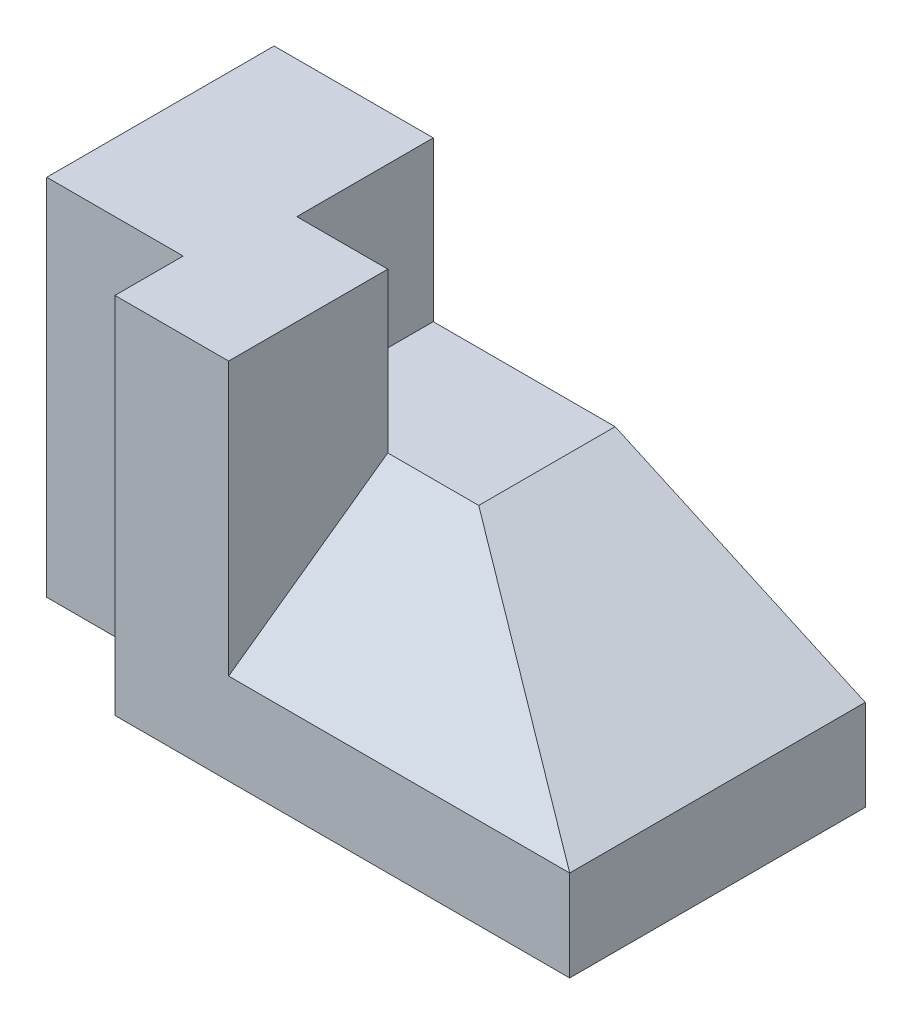
ISO-10303-21;
HEADER;
FILE_DESCRIPTION(('STEP AP214'),'2;1');
FILE_NAME('part.step','',(''),(''),'','','');
FILE_SCHEMA(('AUTOMOTIVE_DESIGN { 1 0 10303 214 1 1 1 1 }'));
ENDSEC;
DATA;
#1=APPLICATION_CONTEXT('core data for automotive mechanical design processes');
#2=APPLICATION_PROTOCOL_DEFINITION('international standard','automotive_design',2000,#1);
#3=PRODUCT_CONTEXT('',#1,'mechanical');
#4=PRODUCT('Part','Part','',(#3));
#5=PRODUCT_RELATED_PRODUCT_CATEGORY('part','',(#4));
#6=PRODUCT_DEFINITION_FORMATION('','',#4);
#7=PRODUCT_DEFINITION_CONTEXT('part definition',#1,'design');
#8=PRODUCT_DEFINITION('design','',#6,#7);
#9=PRODUCT_DEFINITION_SHAPE('','',#8);
#10=(LENGTH_UNIT() NAMED_UNIT(*) SI_UNIT(.MILLI.,.METRE.));
#11=(NAMED_UNIT(*) PLANE_ANGLE_UNIT() SI_UNIT($,.RADIAN.));
#12=(NAMED_UNIT(*) SI_UNIT($,.STERADIAN.) SOLID_ANGLE_UNIT());
#13=UNCERTAINTY_MEASURE_WITH_UNIT(LENGTH_MEASURE(1.E-05),#10,'distance_accuracy_value','');
#14=(GEOMETRIC_REPRESENTATION_CONTEXT(3) GLOBAL_UNCERTAINTY_ASSIGNED_CONTEXT((#13)) GLOBAL_UNIT_ASSIGNED_CONTEXT((#10,
#11,#12)) REPRESENTATION_CONTEXT('',''));
#15=CARTESIAN_POINT('',(0.,0.,0.));
#16=DIRECTION('',(0.,0.,1.));
#17=DIRECTION('',(1.,0.,0.));
#18=AXIS2_PLACEMENT_3D('',#15,#16,#17);
#19=CARTESIAN_POINT('',(0.,0.,-20.));
#20=DIRECTION('',(0.,0.,1.));
#21=DIRECTION('',(1.,0.,0.));
#22=AXIS2_PLACEMENT_3D('',#19,#20,#21);
#23=PLANE('',#22);
#24=DIRECTION('',(0.,-1.,0.));
#25=VECTOR('',#24,1.);
#26=CARTESIAN_POINT('',(5.,45.,-20.));
#27=LINE('',#26,#25);
#28=CARTESIAN_POINT('',(5.,80.,-20.));
#29=VERTEX_POINT('',#28);
#30=CARTESIAN_POINT('',(5.,45.,-20.));
#31=VERTEX_POINT('',#30);
#32=EDGE_CURVE('E142',#29,#31,#27,.T.);
#33=ORIENTED_EDGE('',*,*,#32,.F.);
#34=DIRECTION('',(1.,0.,0.));
#35=VECTOR('',#34,1.);
#36=CARTESIAN_POINT('',(0.,80.,-20.));
#37=LINE('',#36,#35);
#38=CARTESIAN_POINT('',(25.,80.,-20.));
#39=VERTEX_POINT('',#38);
#40=EDGE_CURVE('E147',#29,#39,#37,.T.);
#41=ORIENTED_EDGE('',*,*,#40,.T.);
#42=DIRECTION('',(0.,-1.,0.));
#43=VECTOR('',#42,1.);
#44=CARTESIAN_POINT('',(25.,0.,-20.));
#45=LINE('',#44,#43);
#46=CARTESIAN_POINT('',(25.,45.,-20.));
#47=VERTEX_POINT('',#46);
#48=EDGE_CURVE('E214',#39,#47,#45,.T.);
#49=ORIENTED_EDGE('',*,*,#48,.T.);
#50=DIRECTION('',(1.,0.,0.));
#51=VECTOR('',#50,1.);
#52=CARTESIAN_POINT('',(0.,45.,-20.));
#53=LINE('',#52,#51);
#54=EDGE_CURVE('E180',#31,#47,#53,.T.);
#55=ORIENTED_EDGE('',*,*,#54,.F.);
#56=EDGE_LOOP('',(#33,#41,#49,#55));
#57=FACE_BOUND('',#56,.T.);
#58=ADVANCED_FACE('F42',(#57),#23,.F.);
#59=CARTESIAN_POINT('',(0.,45.,-50.));
#60=DIRECTION('',(0.,-1.,0.));
#61=DIRECTION('',(0.,0.,-1.));
#62=AXIS2_PLACEMENT_3D('',#59,#60,#61);
#63=PLANE('',#62);
#64=DIRECTION('',(0.,0.,1.));
#65=VECTOR('',#64,1.);
#66=CARTESIAN_POINT('',(5.,45.,-50.));
#67=LINE('',#66,#65);
#68=CARTESIAN_POINT('',(4.99999999999999,45.,-50.));
#69=VERTEX_POINT('',#68);
#70=EDGE_CURVE('E58',#69,#31,#67,.T.);
#71=ORIENTED_EDGE('',*,*,#70,.T.);
#72=ORIENTED_EDGE('',*,*,#54,.T.);
#73=DIRECTION('',(1.,0.,0.));
#74=VECTOR('',#73,1.);
#75=CARTESIAN_POINT('',(25.,45.,-20.));
#76=LINE('',#75,#74);
#77=CARTESIAN_POINT('',(45.,45.,-20.));
#78=VERTEX_POINT('',#77);
#79=EDGE_CURVE('E159',#47,#78,#76,.T.);
#80=ORIENTED_EDGE('',*,*,#79,.T.);
#81=DIRECTION('',(0.,0.,1.));
#82=VECTOR('',#81,1.);
#83=CARTESIAN_POINT('',(45.,45.,-50.));
#84=LINE('',#83,#82);
#85=CARTESIAN_POINT('',(45.,45.,-50.));
#86=VERTEX_POINT('',#85);
#87=EDGE_CURVE('E168',#86,#78,#84,.T.);
#88=ORIENTED_EDGE('',*,*,#87,.F.);
#89=DIRECTION('',(1.,0.,0.));
#90=VECTOR('',#89,1.);
#91=CARTESIAN_POINT('',(0.,45.,-50.));
#92=LINE('',#91,#90);
#93=EDGE_CURVE('E65',#69,#86,#92,.T.);
#94=ORIENTED_EDGE('',*,*,#93,.F.);
#95=EDGE_LOOP('',(#71,#72,#80,#88,#94));
#96=FACE_BOUND('',#95,.T.);
#97=ADVANCED_FACE('F269',(#96),#63,.F.);
#98=CARTESIAN_POINT('',(0.,0.,-50.));
#99=DIRECTION('',(0.,1.,0.));
#100=DIRECTION('',(-1.,0.,0.));
#101=AXIS2_PLACEMENT_3D('',#98,#99,#100);
#102=PLANE('',#101);
#103=DIRECTION('',(0.,0.,1.));
#104=VECTOR('',#103,1.);
#105=CARTESIAN_POINT('',(100.,0.,-20.));
#106=LINE('',#105,#104);
#107=CARTESIAN_POINT('',(100.,0.,-50.));
#108=VERTEX_POINT('',#107);
#109=CARTESIAN_POINT('',(100.,0.,15.));
#110=VERTEX_POINT('',#109);
#111=EDGE_CURVE('E220',#108,#110,#106,.T.);
#112=ORIENTED_EDGE('',*,*,#111,.T.);
#113=DIRECTION('',(-1.,0.,0.));
#114=VECTOR('',#113,1.);
#115=CARTESIAN_POINT('',(0.,0.,15.));
#116=LINE('',#115,#114);
#117=CARTESIAN_POINT('',(0.,0.,15.));
#118=VERTEX_POINT('',#117);
#119=EDGE_CURVE('E186',#110,#118,#116,.T.);
#120=ORIENTED_EDGE('',*,*,#119,.T.);
#121=DIRECTION('',(0.,0.,-1.));
#122=VECTOR('',#121,1.);
#123=CARTESIAN_POINT('',(0.,0.,15.));
#124=LINE('',#123,#122);
#125=CARTESIAN_POINT('',(0.,0.,0.));
#126=VERTEX_POINT('',#125);
#127=EDGE_CURVE('E203',#118,#126,#124,.T.);
#128=ORIENTED_EDGE('',*,*,#127,.T.);
#129=DIRECTION('',(-1.,0.,0.));
#130=VECTOR('',#129,1.);
#131=CARTESIAN_POINT('',(0.,0.,0.));
#132=LINE('',#131,#130);
#133=CARTESIAN_POINT('',(-30.,0.,0.));
#134=VERTEX_POINT('',#133);
#135=EDGE_CURVE('E136',#126,#134,#132,.T.);
#136=ORIENTED_EDGE('',*,*,#135,.T.);
#137=DIRECTION('',(0.,0.,1.));
#138=VECTOR('',#137,1.);
#139=CARTESIAN_POINT('',(-30.,0.,-50.));
#140=LINE('',#139,#138);
#141=CARTESIAN_POINT('',(-30.,0.,-50.));
#142=VERTEX_POINT('',#141);
#143=EDGE_CURVE('E51',#142,#134,#140,.T.);
#144=ORIENTED_EDGE('',*,*,#143,.F.);
#145=DIRECTION('',(-1.,0.,0.));
#146=VECTOR('',#145,1.);
#147=CARTESIAN_POINT('',(0.,0.,-50.));
#148=LINE('',#147,#146);
#149=EDGE_CURVE('E230',#108,#142,#148,.T.);
#150=ORIENTED_EDGE('',*,*,#149,.F.);
#151=EDGE_LOOP('',(#112,#120,#128,#136,#144,#150));
#152=FACE_BOUND('',#151,.T.);
#153=ADVANCED_FACE('F278',(#152),#102,.F.);
#154=CARTESIAN_POINT('',(-30.,0.,-50.));
#155=DIRECTION('',(1.,0.,0.));
#156=DIRECTION('',(0.,0.,-1.));
#157=AXIS2_PLACEMENT_3D('',#154,#155,#156);
#158=PLANE('',#157);
#159=DIRECTION('',(0.,1.,0.));
#160=VECTOR('',#159,1.);
#161=CARTESIAN_POINT('',(-30.,0.,0.));
#162=LINE('',#161,#160);
#163=CARTESIAN_POINT('',(-30.,80.,0.));
#164=VERTEX_POINT('',#163);
#165=EDGE_CURVE('E236',#134,#164,#162,.T.);
#166=ORIENTED_EDGE('',*,*,#165,.T.);
#167=DIRECTION('',(0.,0.,1.));
#168=VECTOR('',#167,1.);
#169=CARTESIAN_POINT('',(-30.,80.,-50.));
#170=LINE('',#169,#168);
#171=CARTESIAN_POINT('',(-30.,80.,-50.));
#172=VERTEX_POINT('',#171);
#173=EDGE_CURVE('E233',#172,#164,#170,.T.);
#174=ORIENTED_EDGE('',*,*,#173,.F.);
#175=DIRECTION('',(0.,1.,0.));
#176=VECTOR('',#175,1.);
#177=CARTESIAN_POINT('',(-30.,0.,-50.));
#178=LINE('',#177,#176);
#179=EDGE_CURVE('E130',#142,#172,#178,.T.);
#180=ORIENTED_EDGE('',*,*,#179,.F.);
#181=ORIENTED_EDGE('',*,*,#143,.T.);
#182=EDGE_LOOP('',(#166,#174,#180,#181));
#183=FACE_BOUND('',#182,.T.);
#184=ADVANCED_FACE('F280',(#183),#158,.F.);
#185=CARTESIAN_POINT('',(0.,80.,-50.));
#186=DIRECTION('',(0.,-1.,0.));
#187=DIRECTION('',(0.,0.,-1.));
#188=AXIS2_PLACEMENT_3D('',#185,#186,#187);
#189=PLANE('',#188);
#190=DIRECTION('',(1.,0.,0.));
#191=VECTOR('',#190,1.);
#192=CARTESIAN_POINT('',(0.,80.,0.));
#193=LINE('',#192,#191);
#194=CARTESIAN_POINT('',(0.,80.,0.));
#195=VERTEX_POINT('',#194);
#196=EDGE_CURVE('E224',#164,#195,#193,.T.);
#197=ORIENTED_EDGE('',*,*,#196,.T.);
#198=DIRECTION('',(0.,0.,-1.));
#199=VECTOR('',#198,1.);
#200=CARTESIAN_POINT('',(0.,80.,15.));
#201=LINE('',#200,#199);
#202=CARTESIAN_POINT('',(0.,80.,15.));
#203=VERTEX_POINT('',#202);
#204=EDGE_CURVE('E210',#203,#195,#201,.T.);
#205=ORIENTED_EDGE('',*,*,#204,.F.);
#206=DIRECTION('',(1.,0.,0.));
#207=VECTOR('',#206,1.);
#208=CARTESIAN_POINT('',(0.,80.,15.));
#209=LINE('',#208,#207);
#210=CARTESIAN_POINT('',(25.,80.,15.));
#211=VERTEX_POINT('',#210);
#212=EDGE_CURVE('E196',#203,#211,#209,.T.);
#213=ORIENTED_EDGE('',*,*,#212,.T.);
#214=DIRECTION('',(0.,0.,1.));
#215=VECTOR('',#214,1.);
#216=CARTESIAN_POINT('',(25.,80.,-20.));
#217=LINE('',#216,#215);
#218=EDGE_CURVE('E221',#39,#211,#217,.T.);
#219=ORIENTED_EDGE('',*,*,#218,.F.);
#220=ORIENTED_EDGE('',*,*,#40,.F.);
#221=DIRECTION('',(0.,0.,1.));
#222=VECTOR('',#221,1.);
#223=CARTESIAN_POINT('',(5.,80.,-50.));
#224=LINE('',#223,#222);
#225=CARTESIAN_POINT('',(5.,80.,-50.));
#226=VERTEX_POINT('',#225);
#227=EDGE_CURVE('E139',#226,#29,#224,.T.);
#228=ORIENTED_EDGE('',*,*,#227,.F.);
#229=DIRECTION('',(1.,0.,0.));
#230=VECTOR('',#229,1.);
#231=CARTESIAN_POINT('',(0.,80.,-50.));
#232=LINE('',#231,#230);
#233=EDGE_CURVE('E126',#172,#226,#232,.T.);
#234=ORIENTED_EDGE('',*,*,#233,.F.);
#235=ORIENTED_EDGE('',*,*,#173,.T.);
#236=EDGE_LOOP('',(#197,#205,#213,#219,#220,#228,#234,#235));
#237=FACE_BOUND('',#236,.T.);
#238=ADVANCED_FACE('F44',(#237),#189,.F.);
#239=CARTESIAN_POINT('',(0.,0.,-50.));
#240=DIRECTION('',(0.,0.,1.));
#241=DIRECTION('',(1.,0.,0.));
#242=AXIS2_PLACEMENT_3D('',#239,#240,#241);
#243=PLANE('',#242);
#244=ORIENTED_EDGE('',*,*,#233,.T.);
#245=DIRECTION('',(0.,-1.,0.));
#246=VECTOR('',#245,1.);
#247=CARTESIAN_POINT('',(5.,45.,-50.));
#248=LINE('',#247,#246);
#249=EDGE_CURVE('E128',#226,#69,#248,.T.);
#250=ORIENTED_EDGE('',*,*,#249,.T.);
#251=ORIENTED_EDGE('',*,*,#93,.T.);
#252=DIRECTION('',(0.910366477462605,-0.413802944301184,0.));
#253=VECTOR('',#252,1.);
#254=CARTESIAN_POINT('',(100.,20.,-50.));
#255=LINE('',#254,#253);
#256=CARTESIAN_POINT('',(100.,20.,-50.));
#257=VERTEX_POINT('',#256);
#258=EDGE_CURVE('E163',#86,#257,#255,.T.);
#259=ORIENTED_EDGE('',*,*,#258,.T.);
#260=DIRECTION('',(0.,1.,0.));
#261=VECTOR('',#260,1.);
#262=CARTESIAN_POINT('',(100.,20.,-50.));
#263=LINE('',#262,#261);
#264=EDGE_CURVE('E173',#108,#257,#263,.T.);
#265=ORIENTED_EDGE('',*,*,#264,.F.);
#266=ORIENTED_EDGE('',*,*,#149,.T.);
#267=ORIENTED_EDGE('',*,*,#179,.T.);
#268=EDGE_LOOP('',(#244,#250,#251,#259,#265,#266,#267));
#269=FACE_BOUND('',#268,.T.);
#270=ADVANCED_FACE('F127',(#269),#243,.F.);
#271=CARTESIAN_POINT('',(0.,0.,0.));
#272=DIRECTION('',(0.,0.,1.));
#273=DIRECTION('',(1.,0.,0.));
#274=AXIS2_PLACEMENT_3D('',#271,#272,#273);
#275=PLANE('',#274);
#276=DIRECTION('',(0.,-1.,0.));
#277=VECTOR('',#276,1.);
#278=CARTESIAN_POINT('',(0.,0.,0.));
#279=LINE('',#278,#277);
#280=EDGE_CURVE('E183',#195,#126,#279,.T.);
#281=ORIENTED_EDGE('',*,*,#280,.F.);
#282=ORIENTED_EDGE('',*,*,#196,.F.);
#283=ORIENTED_EDGE('',*,*,#165,.F.);
#284=ORIENTED_EDGE('',*,*,#135,.F.);
#285=EDGE_LOOP('',(#281,#282,#283,#284));
#286=FACE_BOUND('',#285,.T.);
#287=ADVANCED_FACE('F248',(#286),#275,.T.);
#288=CARTESIAN_POINT('',(25.,0.,-20.));
#289=DIRECTION('',(-1.,0.,0.));
#290=DIRECTION('',(0.,-1.,0.));
#291=AXIS2_PLACEMENT_3D('',#288,#289,#290);
#292=PLANE('',#291);
#293=DIRECTION('',(0.,-1.,0.));
#294=VECTOR('',#293,1.);
#295=CARTESIAN_POINT('',(25.,0.,15.));
#296=LINE('',#295,#294);
#297=CARTESIAN_POINT('',(25.,20.,15.));
#298=VERTEX_POINT('',#297);
#299=EDGE_CURVE('E193',#211,#298,#296,.T.);
#300=ORIENTED_EDGE('',*,*,#299,.T.);
#301=DIRECTION('',(0.,0.581238193719096,-0.813733471206735));
#302=VECTOR('',#301,1.);
#303=CARTESIAN_POINT('',(25.,45.,-20.));
#304=LINE('',#303,#302);
#305=EDGE_CURVE('E149',#298,#47,#304,.T.);
#306=ORIENTED_EDGE('',*,*,#305,.T.);
#307=ORIENTED_EDGE('',*,*,#48,.F.);
#308=ORIENTED_EDGE('',*,*,#218,.T.);
#309=EDGE_LOOP('',(#300,#306,#307,#308));
#310=FACE_BOUND('',#309,.T.);
#311=ADVANCED_FACE('F263',(#310),#292,.F.);
#312=CARTESIAN_POINT('',(100.,0.,-20.));
#313=DIRECTION('',(-1.,0.,0.));
#314=DIRECTION('',(0.,0.,1.));
#315=AXIS2_PLACEMENT_3D('',#312,#313,#314);
#316=PLANE('',#315);
#317=ORIENTED_EDGE('',*,*,#264,.T.);
#318=DIRECTION('',(0.,0.,1.));
#319=VECTOR('',#318,1.);
#320=CARTESIAN_POINT('',(100.,20.,-50.));
#321=LINE('',#320,#319);
#322=CARTESIAN_POINT('',(100.,20.,15.));
#323=VERTEX_POINT('',#322);
#324=EDGE_CURVE('E169',#257,#323,#321,.T.);
#325=ORIENTED_EDGE('',*,*,#324,.T.);
#326=DIRECTION('',(0.,-1.,0.));
#327=VECTOR('',#326,1.);
#328=CARTESIAN_POINT('',(100.,0.,15.));
#329=LINE('',#328,#327);
#330=EDGE_CURVE('E190',#323,#110,#329,.T.);
#331=ORIENTED_EDGE('',*,*,#330,.T.);
#332=ORIENTED_EDGE('',*,*,#111,.F.);
#333=EDGE_LOOP('',(#317,#325,#331,#332));
#334=FACE_BOUND('',#333,.T.);
#335=ADVANCED_FACE('F276',(#334),#316,.F.);
#336=CARTESIAN_POINT('',(0.,0.,15.));
#337=DIRECTION('',(1.,0.,0.));
#338=DIRECTION('',(0.,1.,0.));
#339=AXIS2_PLACEMENT_3D('',#336,#337,#338);
#340=PLANE('',#339);
#341=ORIENTED_EDGE('',*,*,#280,.T.);
#342=ORIENTED_EDGE('',*,*,#127,.F.);
#343=DIRECTION('',(0.,-1.,0.));
#344=VECTOR('',#343,1.);
#345=CARTESIAN_POINT('',(0.,0.,15.));
#346=LINE('',#345,#344);
#347=EDGE_CURVE('E200',#203,#118,#346,.T.);
#348=ORIENTED_EDGE('',*,*,#347,.F.);
#349=ORIENTED_EDGE('',*,*,#204,.T.);
#350=EDGE_LOOP('',(#341,#342,#348,#349));
#351=FACE_BOUND('',#350,.T.);
#352=ADVANCED_FACE('F251',(#351),#340,.F.);
#353=CARTESIAN_POINT('',(0.,0.,15.));
#354=DIRECTION('',(0.,0.,1.));
#355=DIRECTION('',(1.,0.,0.));
#356=AXIS2_PLACEMENT_3D('',#353,#354,#355);
#357=PLANE('',#356);
#358=DIRECTION('',(1.,0.,0.));
#359=VECTOR('',#358,1.);
#360=CARTESIAN_POINT('',(25.,20.,15.));
#361=LINE('',#360,#359);
#362=EDGE_CURVE('E154',#298,#323,#361,.T.);
#363=ORIENTED_EDGE('',*,*,#362,.F.);
#364=ORIENTED_EDGE('',*,*,#299,.F.);
#365=ORIENTED_EDGE('',*,*,#212,.F.);
#366=ORIENTED_EDGE('',*,*,#347,.T.);
#367=ORIENTED_EDGE('',*,*,#119,.F.);
#368=ORIENTED_EDGE('',*,*,#330,.F.);
#369=EDGE_LOOP('',(#363,#364,#365,#366,#367,#368));
#370=FACE_BOUND('',#369,.T.);
#371=ADVANCED_FACE('F258',(#370),#357,.T.);
#372=CARTESIAN_POINT('',(100.,20.,-50.));
#373=DIRECTION('',(-0.413802944301184,-0.910366477462605,0.));
#374=DIRECTION('',(0.910366477462605,-0.413802944301184,0.));
#375=AXIS2_PLACEMENT_3D('',#372,#373,#374);
#376=PLANE('',#375);
#377=ORIENTED_EDGE('',*,*,#87,.T.);
#378=DIRECTION('',(0.787726361443376,-0.358057437019717,0.501280411827603));
#379=VECTOR('',#378,1.);
#380=CARTESIAN_POINT('',(74.3333333333333,31.6666666666667,-1.33333333333334));
#381=LINE('',#380,#379);
#382=EDGE_CURVE('E11',#78,#323,#381,.T.);
#383=ORIENTED_EDGE('',*,*,#382,.T.);
#384=ORIENTED_EDGE('',*,*,#324,.F.);
#385=ORIENTED_EDGE('',*,*,#258,.F.);
#386=EDGE_LOOP('',(#377,#383,#384,#385));
#387=FACE_BOUND('',#386,.T.);
#388=ADVANCED_FACE('F272',(#387),#376,.F.);
#389=CARTESIAN_POINT('',(25.,45.,-20.));
#390=DIRECTION('',(0.,-0.813733471206735,-0.581238193719096));
#391=DIRECTION('',(0.,0.581238193719096,-0.813733471206735));
#392=AXIS2_PLACEMENT_3D('',#389,#390,#391);
#393=PLANE('',#392);
#394=ORIENTED_EDGE('',*,*,#79,.F.);
#395=ORIENTED_EDGE('',*,*,#305,.F.);
#396=ORIENTED_EDGE('',*,*,#362,.T.);
#397=ORIENTED_EDGE('',*,*,#382,.F.);
#398=EDGE_LOOP('',(#394,#395,#396,#397));
#399=FACE_BOUND('',#398,.T.);
#400=ADVANCED_FACE('F266',(#399),#393,.F.);
#401=CARTESIAN_POINT('',(5.,45.,-50.));
#402=DIRECTION('',(-1.,0.,0.));
#403=DIRECTION('',(0.,0.,1.));
#404=AXIS2_PLACEMENT_3D('',#401,#402,#403);
#405=PLANE('',#404);
#406=ORIENTED_EDGE('',*,*,#32,.T.);
#407=ORIENTED_EDGE('',*,*,#70,.F.);
#408=ORIENTED_EDGE('',*,*,#249,.F.);
#409=ORIENTED_EDGE('',*,*,#227,.T.);
#410=EDGE_LOOP('',(#406,#407,#408,#409));
#411=FACE_BOUND('',#410,.T.);
#412=ADVANCED_FACE('F138',(#411),#405,.F.);
#413=CLOSED_SHELL('',(#58,#97,#153,#184,#238,#270,#287,#311,#335,#352,#371,#388,#400,#412));
#414=MANIFOLD_SOLID_BREP('B2',#413);
#415=ADVANCED_BREP_SHAPE_REPRESENTATION('',(#18,#414),#14);
#416=SHAPE_DEFINITION_REPRESENTATION(#9,#415);
ENDSEC;
END-ISO-10303-21;
